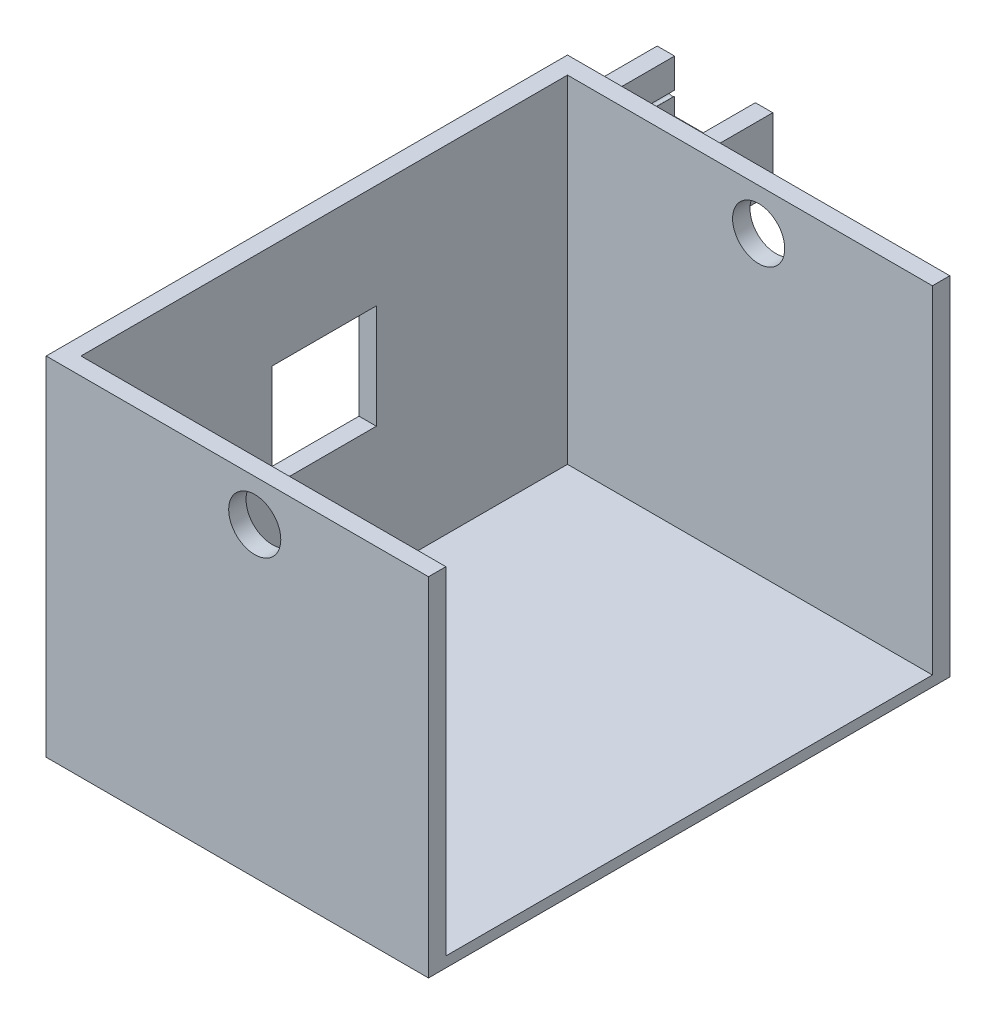
ISO-10303-21;
HEADER;
FILE_DESCRIPTION(('STEP AP214'),'2;1');
FILE_NAME('part.step','',(''),(''),'','','');
FILE_SCHEMA(('AUTOMOTIVE_DESIGN { 1 0 10303 214 1 1 1 1 }'));
ENDSEC;
DATA;
#1=APPLICATION_CONTEXT('core data for automotive mechanical design processes');
#2=APPLICATION_PROTOCOL_DEFINITION('international standard','automotive_design',2000,#1);
#3=PRODUCT_CONTEXT('',#1,'mechanical');
#4=PRODUCT('Part','Part','',(#3));
#5=PRODUCT_RELATED_PRODUCT_CATEGORY('part','',(#4));
#6=PRODUCT_DEFINITION_FORMATION('','',#4);
#7=PRODUCT_DEFINITION_CONTEXT('part definition',#1,'design');
#8=PRODUCT_DEFINITION('design','',#6,#7);
#9=PRODUCT_DEFINITION_SHAPE('','',#8);
#10=(LENGTH_UNIT() NAMED_UNIT(*) SI_UNIT(.MILLI.,.METRE.));
#11=(NAMED_UNIT(*) PLANE_ANGLE_UNIT() SI_UNIT($,.RADIAN.));
#12=(NAMED_UNIT(*) SI_UNIT($,.STERADIAN.) SOLID_ANGLE_UNIT());
#13=UNCERTAINTY_MEASURE_WITH_UNIT(LENGTH_MEASURE(1.E-05),#10,'distance_accuracy_value','');
#14=(GEOMETRIC_REPRESENTATION_CONTEXT(3) GLOBAL_UNCERTAINTY_ASSIGNED_CONTEXT((#13)) GLOBAL_UNIT_ASSIGNED_CONTEXT((#10,
#11,#12)) REPRESENTATION_CONTEXT('',''));
#15=CARTESIAN_POINT('',(0.,0.,0.));
#16=DIRECTION('',(0.,0.,1.));
#17=DIRECTION('',(1.,0.,0.));
#18=AXIS2_PLACEMENT_3D('',#15,#16,#17);
#19=CARTESIAN_POINT('',(45.6699478574615,81.8999999999859,-88.8582089552239));
#20=DIRECTION('',(-1.,0.,0.));
#21=DIRECTION('',(0.,-1.,0.));
#22=AXIS2_PLACEMENT_3D('',#19,#20,#21);
#23=PLANE('',#22);
#24=DIRECTION('',(0.,-1.,0.));
#25=VECTOR('',#24,1.);
#26=CARTESIAN_POINT('',(45.6699478574615,81.8999999999859,-70.6082089552239));
#27=LINE('',#26,#25);
#28=CARTESIAN_POINT('',(45.6699478574615,96.899999999986,-70.6082089552239));
#29=VERTEX_POINT('',#28);
#30=CARTESIAN_POINT('',(45.6699478574615,88.3872440663465,-70.6082089552239));
#31=VERTEX_POINT('',#30);
#32=EDGE_CURVE('E279',#29,#31,#27,.T.);
#33=ORIENTED_EDGE('',*,*,#32,.T.);
#34=DIRECTION('',(0.,0.,-1.));
#35=VECTOR('',#34,1.);
#36=CARTESIAN_POINT('',(45.6699478574615,88.3872440663465,-70.6082089552239));
#37=LINE('',#36,#35);
#38=CARTESIAN_POINT('',(45.6699478574615,88.3872440663465,-88.8582089552239));
#39=VERTEX_POINT('',#38);
#40=EDGE_CURVE('E247',#31,#39,#37,.T.);
#41=ORIENTED_EDGE('',*,*,#40,.T.);
#42=DIRECTION('',(0.,-1.,0.));
#43=VECTOR('',#42,1.);
#44=CARTESIAN_POINT('',(45.6699478574615,81.8999999999859,-88.8582089552239));
#45=LINE('',#44,#43);
#46=CARTESIAN_POINT('',(45.6699478574615,96.899999999986,-88.8582089552239));
#47=VERTEX_POINT('',#46);
#48=EDGE_CURVE('E252',#47,#39,#45,.T.);
#49=ORIENTED_EDGE('',*,*,#48,.F.);
#50=DIRECTION('',(0.,0.,1.));
#51=VECTOR('',#50,1.);
#52=CARTESIAN_POINT('',(45.6699478574615,96.899999999986,-88.8582089552239));
#53=LINE('',#52,#51);
#54=EDGE_CURVE('E278',#47,#29,#53,.T.);
#55=ORIENTED_EDGE('',*,*,#54,.T.);
#56=EDGE_LOOP('',(#33,#41,#49,#55));
#57=FACE_BOUND('',#56,.T.);
#58=ADVANCED_FACE('F47',(#57),#23,.F.);
#59=CARTESIAN_POINT('',(33.1119402985075,200.,-70.6082089552239));
#60=DIRECTION('',(0.,0.,1.));
#61=DIRECTION('',(1.,0.,0.));
#62=AXIS2_PLACEMENT_3D('',#59,#60,#61);
#63=PLANE('',#62);
#64=DIRECTION('',(0.,-1.,0.));
#65=VECTOR('',#64,1.);
#66=CARTESIAN_POINT('',(33.1119402985075,200.,-70.6082089552239));
#67=LINE('',#66,#65);
#68=CARTESIAN_POINT('',(33.1119402985076,100.,-70.6082089552239));
#69=VERTEX_POINT('',#68);
#70=CARTESIAN_POINT('',(33.1119402985075,0.,-70.6082089552239));
#71=VERTEX_POINT('',#70);
#72=EDGE_CURVE('E419',#69,#71,#67,.T.);
#73=ORIENTED_EDGE('',*,*,#72,.F.);
#74=DIRECTION('',(1.,0.,0.));
#75=VECTOR('',#74,1.);
#76=CARTESIAN_POINT('',(143.111940298508,100.,-70.6082089552239));
#77=LINE('',#76,#75);
#78=CARTESIAN_POINT('',(143.111940298508,100.,-70.6082089552239));
#79=VERTEX_POINT('',#78);
#80=EDGE_CURVE('E388',#69,#79,#77,.T.);
#81=ORIENTED_EDGE('',*,*,#80,.T.);
#82=DIRECTION('',(0.,-1.,0.));
#83=VECTOR('',#82,1.);
#84=CARTESIAN_POINT('',(143.111940298508,200.,-70.6082089552239));
#85=LINE('',#84,#83);
#86=CARTESIAN_POINT('',(143.111940298508,0.,-70.6082089552239));
#87=VERTEX_POINT('',#86);
#88=EDGE_CURVE('E422',#79,#87,#85,.T.);
#89=ORIENTED_EDGE('',*,*,#88,.T.);
#90=DIRECTION('',(-1.,0.,0.));
#91=VECTOR('',#90,1.);
#92=CARTESIAN_POINT('',(33.1119402985075,0.,-70.6082089552239));
#93=LINE('',#92,#91);
#94=EDGE_CURVE('E415',#87,#71,#93,.T.);
#95=ORIENTED_EDGE('',*,*,#94,.T.);
#96=EDGE_LOOP('',(#73,#81,#89,#95));
#97=FACE_BOUND('',#96,.T.);
#98=CARTESIAN_POINT('',(93.1119402985076,88.,-70.6082089552239));
#99=DIRECTION('',(0.,0.,1.));
#100=DIRECTION('',(1.,0.,0.));
#101=AXIS2_PLACEMENT_3D('',#98,#99,#100);
#102=CIRCLE('',#101,7.50000000000003);
#103=CARTESIAN_POINT('',(100.611940298508,88.,-70.6082089552239));
#104=VERTEX_POINT('',#103);
#105=EDGE_CURVE('E342',#104,#104,#102,.T.);
#106=ORIENTED_EDGE('',*,*,#105,.T.);
#107=EDGE_LOOP('',(#106));
#108=FACE_BOUND('',#107,.T.);
#109=CARTESIAN_POINT('',(45.6699478574615,86.9138839047077,-70.6082089552239));
#110=VERTEX_POINT('',#109);
#111=CARTESIAN_POINT('',(45.6699478574615,81.8999999999859,-70.6082089552239));
#112=VERTEX_POINT('',#111);
#113=EDGE_CURVE('E251',#110,#112,#27,.T.);
#114=ORIENTED_EDGE('',*,*,#113,.F.);
#115=CARTESIAN_POINT('',(44.8760213344979,87.6505639855271,-70.6082089552239));
#116=DIRECTION('',(0.,0.,-1.));
#117=DIRECTION('',(-1.,0.,0.));
#118=AXIS2_PLACEMENT_3D('',#115,#116,#117);
#119=CIRCLE('',#118,1.08305903132807);
#120=EDGE_CURVE('E232',#110,#31,#119,.T.);
#121=ORIENTED_EDGE('',*,*,#120,.T.);
#122=ORIENTED_EDGE('',*,*,#32,.F.);
#123=DIRECTION('',(1.,0.,0.));
#124=VECTOR('',#123,1.);
#125=CARTESIAN_POINT('',(45.6699478574615,96.899999999986,-70.6082089552239));
#126=LINE('',#125,#124);
#127=CARTESIAN_POINT('',(40.6699478574615,96.899999999986,-70.6082089552239));
#128=VERTEX_POINT('',#127);
#129=EDGE_CURVE('E307',#128,#29,#126,.T.);
#130=ORIENTED_EDGE('',*,*,#129,.F.);
#131=DIRECTION('',(0.,1.,0.));
#132=VECTOR('',#131,1.);
#133=CARTESIAN_POINT('',(40.6699478574615,76.899999999986,-70.6082089552239));
#134=LINE('',#133,#132);
#135=CARTESIAN_POINT('',(40.6699478574615,76.899999999986,-70.6082089552239));
#136=VERTEX_POINT('',#135);
#137=EDGE_CURVE('E303',#136,#128,#134,.T.);
#138=ORIENTED_EDGE('',*,*,#137,.F.);
#139=DIRECTION('',(-1.,0.,0.));
#140=VECTOR('',#139,1.);
#141=CARTESIAN_POINT('',(73.9199478574615,76.899999999986,-70.6082089552239));
#142=LINE('',#141,#140);
#143=CARTESIAN_POINT('',(73.9199478574615,76.899999999986,-70.6082089552239));
#144=VERTEX_POINT('',#143);
#145=EDGE_CURVE('E299',#144,#136,#142,.T.);
#146=ORIENTED_EDGE('',*,*,#145,.F.);
#147=DIRECTION('',(0.,-1.,0.));
#148=VECTOR('',#147,1.);
#149=CARTESIAN_POINT('',(73.9199478574615,76.899999999986,-70.6082089552239));
#150=LINE('',#149,#148);
#151=CARTESIAN_POINT('',(73.9199478574615,96.899999999986,-70.6082089552239));
#152=VERTEX_POINT('',#151);
#153=EDGE_CURVE('E295',#152,#144,#150,.T.);
#154=ORIENTED_EDGE('',*,*,#153,.F.);
#155=DIRECTION('',(1.,0.,0.));
#156=VECTOR('',#155,1.);
#157=CARTESIAN_POINT('',(68.9199478574616,96.899999999986,-70.6082089552239));
#158=LINE('',#157,#156);
#159=CARTESIAN_POINT('',(68.9199478574616,96.899999999986,-70.6082089552239));
#160=VERTEX_POINT('',#159);
#161=EDGE_CURVE('E291',#160,#152,#158,.T.);
#162=ORIENTED_EDGE('',*,*,#161,.F.);
#163=DIRECTION('',(0.,1.,0.));
#164=VECTOR('',#163,1.);
#165=CARTESIAN_POINT('',(68.9199478574616,96.899999999986,-70.6082089552239));
#166=LINE('',#165,#164);
#167=CARTESIAN_POINT('',(68.9199478574616,81.8999999999859,-70.6082089552239));
#168=VERTEX_POINT('',#167);
#169=EDGE_CURVE('E287',#168,#160,#166,.T.);
#170=ORIENTED_EDGE('',*,*,#169,.F.);
#171=DIRECTION('',(1.,0.,0.));
#172=VECTOR('',#171,1.);
#173=CARTESIAN_POINT('',(45.6699478574615,81.8999999999859,-70.6082089552239));
#174=LINE('',#173,#172);
#175=EDGE_CURVE('E283',#112,#168,#174,.T.);
#176=ORIENTED_EDGE('',*,*,#175,.F.);
#177=EDGE_LOOP('',(#114,#121,#122,#130,#138,#146,#154,#162,#170,#176));
#178=FACE_BOUND('',#177,.T.);
#179=ADVANCED_FACE('F472',(#97,#108,#178),#63,.F.);
#180=CARTESIAN_POINT('',(33.1119402985075,200.,-70.6082089552239));
#181=DIRECTION('',(1.,0.,0.));
#182=DIRECTION('',(0.,0.,-1.));
#183=AXIS2_PLACEMENT_3D('',#180,#181,#182);
#184=PLANE('',#183);
#185=DIRECTION('',(0.,0.,1.));
#186=VECTOR('',#185,1.);
#187=CARTESIAN_POINT('',(33.1119402985075,40.,-10.6082089552239));
#188=LINE('',#187,#186);
#189=CARTESIAN_POINT('',(33.1119402985075,40.,-10.6082089552239));
#190=VERTEX_POINT('',#189);
#191=CARTESIAN_POINT('',(33.1119402985075,40.,19.3917910447761));
#192=VERTEX_POINT('',#191);
#193=EDGE_CURVE('E210',#190,#192,#188,.T.);
#194=ORIENTED_EDGE('',*,*,#193,.F.);
#195=DIRECTION('',(0.,-1.,0.));
#196=VECTOR('',#195,1.);
#197=CARTESIAN_POINT('',(33.1119402985075,70.,-10.6082089552239));
#198=LINE('',#197,#196);
#199=CARTESIAN_POINT('',(33.1119402985075,70.,-10.6082089552239));
#200=VERTEX_POINT('',#199);
#201=EDGE_CURVE('E63',#200,#190,#198,.T.);
#202=ORIENTED_EDGE('',*,*,#201,.F.);
#203=DIRECTION('',(0.,0.,-1.));
#204=VECTOR('',#203,1.);
#205=CARTESIAN_POINT('',(33.1119402985075,70.,-10.6082089552239));
#206=LINE('',#205,#204);
#207=CARTESIAN_POINT('',(33.1119402985075,70.,19.3917910447761));
#208=VERTEX_POINT('',#207);
#209=EDGE_CURVE('E217',#208,#200,#206,.T.);
#210=ORIENTED_EDGE('',*,*,#209,.F.);
#211=DIRECTION('',(0.,1.,0.));
#212=VECTOR('',#211,1.);
#213=CARTESIAN_POINT('',(33.1119402985075,70.,19.3917910447761));
#214=LINE('',#213,#212);
#215=EDGE_CURVE('E200',#192,#208,#214,.T.);
#216=ORIENTED_EDGE('',*,*,#215,.F.);
#217=EDGE_LOOP('',(#194,#202,#210,#216));
#218=FACE_BOUND('',#217,.T.);
#219=DIRECTION('',(0.,-1.,0.));
#220=VECTOR('',#219,1.);
#221=CARTESIAN_POINT('',(33.1119402985076,200.,79.3917910447761));
#222=LINE('',#221,#220);
#223=CARTESIAN_POINT('',(33.1119402985076,100.,79.3917910447761));
#224=VERTEX_POINT('',#223);
#225=CARTESIAN_POINT('',(33.1119402985076,0.,79.3917910447761));
#226=VERTEX_POINT('',#225);
#227=EDGE_CURVE('E428',#224,#226,#222,.T.);
#228=ORIENTED_EDGE('',*,*,#227,.F.);
#229=DIRECTION('',(0.,0.,1.));
#230=VECTOR('',#229,1.);
#231=CARTESIAN_POINT('',(33.1119402985076,100.,-70.6082089552239));
#232=LINE('',#231,#230);
#233=EDGE_CURVE('E392',#69,#224,#232,.T.);
#234=ORIENTED_EDGE('',*,*,#233,.F.);
#235=ORIENTED_EDGE('',*,*,#72,.T.);
#236=DIRECTION('',(0.,0.,1.));
#237=VECTOR('',#236,1.);
#238=CARTESIAN_POINT('',(33.1119402985075,0.,-70.6082089552239));
#239=LINE('',#238,#237);
#240=EDGE_CURVE('E400',#71,#226,#239,.T.);
#241=ORIENTED_EDGE('',*,*,#240,.T.);
#242=EDGE_LOOP('',(#228,#234,#235,#241));
#243=FACE_BOUND('',#242,.T.);
#244=ADVANCED_FACE('F49',(#218,#243),#184,.F.);
#245=CARTESIAN_POINT('',(33.1119402985076,200.,79.3917910447761));
#246=DIRECTION('',(0.,0.,-1.));
#247=DIRECTION('',(-1.,0.,0.));
#248=AXIS2_PLACEMENT_3D('',#245,#246,#247);
#249=PLANE('',#248);
#250=CARTESIAN_POINT('',(93.1119402985076,88.,79.3917910447761));
#251=DIRECTION('',(0.,0.,-1.));
#252=DIRECTION('',(-1.,0.,0.));
#253=AXIS2_PLACEMENT_3D('',#250,#251,#252);
#254=CIRCLE('',#253,7.50000000000003);
#255=CARTESIAN_POINT('',(85.6119402985075,88.,79.3917910447761));
#256=VERTEX_POINT('',#255);
#257=EDGE_CURVE('E351',#256,#256,#254,.T.);
#258=ORIENTED_EDGE('',*,*,#257,.T.);
#259=EDGE_LOOP('',(#258));
#260=FACE_BOUND('',#259,.T.);
#261=DIRECTION('',(0.,-1.,0.));
#262=VECTOR('',#261,1.);
#263=CARTESIAN_POINT('',(143.111940298508,200.,79.3917910447761));
#264=LINE('',#263,#262);
#265=CARTESIAN_POINT('',(143.111940298508,100.,79.3917910447761));
#266=VERTEX_POINT('',#265);
#267=CARTESIAN_POINT('',(143.111940298508,0.,79.3917910447761));
#268=VERTEX_POINT('',#267);
#269=EDGE_CURVE('E425',#266,#268,#264,.T.);
#270=ORIENTED_EDGE('',*,*,#269,.F.);
#271=DIRECTION('',(1.,0.,0.));
#272=VECTOR('',#271,1.);
#273=CARTESIAN_POINT('',(143.111940298508,100.,79.3917910447761));
#274=LINE('',#273,#272);
#275=EDGE_CURVE('E387',#224,#266,#274,.T.);
#276=ORIENTED_EDGE('',*,*,#275,.F.);
#277=ORIENTED_EDGE('',*,*,#227,.T.);
#278=DIRECTION('',(1.,0.,0.));
#279=VECTOR('',#278,1.);
#280=CARTESIAN_POINT('',(33.1119402985076,0.,79.3917910447761));
#281=LINE('',#280,#279);
#282=EDGE_CURVE('E407',#226,#268,#281,.T.);
#283=ORIENTED_EDGE('',*,*,#282,.T.);
#284=EDGE_LOOP('',(#270,#276,#277,#283));
#285=FACE_BOUND('',#284,.T.);
#286=ADVANCED_FACE('F651',(#260,#285),#249,.F.);
#287=CARTESIAN_POINT('',(143.111940298508,200.,-70.6082089552239));
#288=DIRECTION('',(-1.,0.,0.));
#289=DIRECTION('',(0.,0.,1.));
#290=AXIS2_PLACEMENT_3D('',#287,#288,#289);
#291=PLANE('',#290);
#292=DIRECTION('',(0.,0.,1.));
#293=VECTOR('',#292,1.);
#294=CARTESIAN_POINT('',(143.111940298508,100.,-70.6082089552239));
#295=LINE('',#294,#293);
#296=CARTESIAN_POINT('',(143.111940298508,100.,-65.6082089552239));
#297=VERTEX_POINT('',#296);
#298=EDGE_CURVE('E396',#79,#297,#295,.T.);
#299=ORIENTED_EDGE('',*,*,#298,.T.);
#300=DIRECTION('',(0.,-1.,0.));
#301=VECTOR('',#300,1.);
#302=CARTESIAN_POINT('',(143.111940298508,200.,-65.6082089552239));
#303=LINE('',#302,#301);
#304=CARTESIAN_POINT('',(143.111940298508,3.,-65.6082089552239));
#305=VERTEX_POINT('',#304);
#306=EDGE_CURVE('E383',#297,#305,#303,.T.);
#307=ORIENTED_EDGE('',*,*,#306,.T.);
#308=DIRECTION('',(0.,0.,-1.));
#309=VECTOR('',#308,1.);
#310=CARTESIAN_POINT('',(143.111940298508,3.,-70.6082089552239));
#311=LINE('',#310,#309);
#312=CARTESIAN_POINT('',(143.111940298508,3.,74.3917910447761));
#313=VERTEX_POINT('',#312);
#314=EDGE_CURVE('E435',#313,#305,#311,.T.);
#315=ORIENTED_EDGE('',*,*,#314,.F.);
#316=DIRECTION('',(0.,1.,0.));
#317=VECTOR('',#316,1.);
#318=CARTESIAN_POINT('',(143.111940298508,200.,74.3917910447761));
#319=LINE('',#318,#317);
#320=CARTESIAN_POINT('',(143.111940298508,100.,74.3917910447761));
#321=VERTEX_POINT('',#320);
#322=EDGE_CURVE('E379',#313,#321,#319,.T.);
#323=ORIENTED_EDGE('',*,*,#322,.T.);
#324=EDGE_CURVE('E401',#321,#266,#295,.T.);
#325=ORIENTED_EDGE('',*,*,#324,.T.);
#326=ORIENTED_EDGE('',*,*,#269,.T.);
#327=DIRECTION('',(0.,0.,-1.));
#328=VECTOR('',#327,1.);
#329=CARTESIAN_POINT('',(143.111940298508,0.,-70.6082089552239));
#330=LINE('',#329,#328);
#331=EDGE_CURVE('E411',#268,#87,#330,.T.);
#332=ORIENTED_EDGE('',*,*,#331,.T.);
#333=ORIENTED_EDGE('',*,*,#88,.F.);
#334=EDGE_LOOP('',(#299,#307,#315,#323,#325,#326,#332,#333));
#335=FACE_BOUND('',#334,.T.);
#336=ADVANCED_FACE('F712',(#335),#291,.F.);
#337=CARTESIAN_POINT('',(0.,0.,0.));
#338=DIRECTION('',(0.,1.,0.));
#339=DIRECTION('',(0.,0.,1.));
#340=AXIS2_PLACEMENT_3D('',#337,#338,#339);
#341=PLANE('',#340);
#342=ORIENTED_EDGE('',*,*,#240,.F.);
#343=ORIENTED_EDGE('',*,*,#94,.F.);
#344=ORIENTED_EDGE('',*,*,#331,.F.);
#345=ORIENTED_EDGE('',*,*,#282,.F.);
#346=EDGE_LOOP('',(#342,#343,#344,#345));
#347=FACE_BOUND('',#346,.T.);
#348=ADVANCED_FACE('F729',(#347),#341,.F.);
#349=CARTESIAN_POINT('',(143.111940298508,100.,-70.6082089552239));
#350=DIRECTION('',(0.,-1.,0.));
#351=DIRECTION('',(0.,0.,-1.));
#352=AXIS2_PLACEMENT_3D('',#349,#350,#351);
#353=PLANE('',#352);
#354=DIRECTION('',(0.,0.,1.));
#355=VECTOR('',#354,1.);
#356=CARTESIAN_POINT('',(38.1119402985076,100.,-65.6082089552239));
#357=LINE('',#356,#355);
#358=CARTESIAN_POINT('',(38.1119402985076,100.,-65.6082089552239));
#359=VERTEX_POINT('',#358);
#360=CARTESIAN_POINT('',(38.1119402985076,100.,74.3917910447761));
#361=VERTEX_POINT('',#360);
#362=EDGE_CURVE('E355',#359,#361,#357,.T.);
#363=ORIENTED_EDGE('',*,*,#362,.F.);
#364=DIRECTION('',(1.,0.,0.));
#365=VECTOR('',#364,1.);
#366=CARTESIAN_POINT('',(143.111940298508,100.,-65.6082089552239));
#367=LINE('',#366,#365);
#368=EDGE_CURVE('E431',#359,#297,#367,.T.);
#369=ORIENTED_EDGE('',*,*,#368,.T.);
#370=ORIENTED_EDGE('',*,*,#298,.F.);
#371=ORIENTED_EDGE('',*,*,#80,.F.);
#372=ORIENTED_EDGE('',*,*,#233,.T.);
#373=ORIENTED_EDGE('',*,*,#275,.T.);
#374=ORIENTED_EDGE('',*,*,#324,.F.);
#375=DIRECTION('',(1.,0.,0.));
#376=VECTOR('',#375,1.);
#377=CARTESIAN_POINT('',(38.1119402985076,100.,74.3917910447761));
#378=LINE('',#377,#376);
#379=EDGE_CURVE('E367',#361,#321,#378,.T.);
#380=ORIENTED_EDGE('',*,*,#379,.F.);
#381=EDGE_LOOP('',(#363,#369,#370,#371,#372,#373,#374,#380));
#382=FACE_BOUND('',#381,.T.);
#383=ADVANCED_FACE('F720',(#382),#353,.F.);
#384=CARTESIAN_POINT('',(0.,3.,0.));
#385=DIRECTION('',(0.,1.,0.));
#386=DIRECTION('',(0.,0.,1.));
#387=AXIS2_PLACEMENT_3D('',#384,#385,#386);
#388=PLANE('',#387);
#389=ORIENTED_EDGE('',*,*,#314,.T.);
#390=DIRECTION('',(1.,0.,0.));
#391=VECTOR('',#390,1.);
#392=CARTESIAN_POINT('',(38.1119402985076,3.,-65.6082089552239));
#393=LINE('',#392,#391);
#394=CARTESIAN_POINT('',(38.1119402985076,3.,-65.6082089552239));
#395=VERTEX_POINT('',#394);
#396=EDGE_CURVE('E356',#395,#305,#393,.T.);
#397=ORIENTED_EDGE('',*,*,#396,.F.);
#398=DIRECTION('',(0.,0.,-1.));
#399=VECTOR('',#398,1.);
#400=CARTESIAN_POINT('',(38.1119402985076,3.,-65.6082089552239));
#401=LINE('',#400,#399);
#402=CARTESIAN_POINT('',(38.1119402985076,3.,74.3917910447761));
#403=VERTEX_POINT('',#402);
#404=EDGE_CURVE('E360',#403,#395,#401,.T.);
#405=ORIENTED_EDGE('',*,*,#404,.F.);
#406=DIRECTION('',(-1.,0.,0.));
#407=VECTOR('',#406,1.);
#408=CARTESIAN_POINT('',(38.1119402985076,3.,74.3917910447761));
#409=LINE('',#408,#407);
#410=EDGE_CURVE('E364',#313,#403,#409,.T.);
#411=ORIENTED_EDGE('',*,*,#410,.F.);
#412=EDGE_LOOP('',(#389,#397,#405,#411));
#413=FACE_BOUND('',#412,.T.);
#414=ADVANCED_FACE('F703',(#413),#388,.T.);
#415=CARTESIAN_POINT('',(38.1119402985076,-190.808405719138,-65.6082089552239));
#416=DIRECTION('',(0.,0.,-1.));
#417=DIRECTION('',(-1.,0.,0.));
#418=AXIS2_PLACEMENT_3D('',#415,#416,#417);
#419=PLANE('',#418);
#420=CARTESIAN_POINT('',(93.1119402985076,88.,-65.6082089552239));
#421=DIRECTION('',(0.,0.,-1.));
#422=DIRECTION('',(-1.,0.,0.));
#423=AXIS2_PLACEMENT_3D('',#420,#421,#422);
#424=CIRCLE('',#423,7.50000000000003);
#425=CARTESIAN_POINT('',(85.6119402985075,88.,-65.6082089552239));
#426=VERTEX_POINT('',#425);
#427=EDGE_CURVE('E347',#426,#426,#424,.T.);
#428=ORIENTED_EDGE('',*,*,#427,.T.);
#429=EDGE_LOOP('',(#428));
#430=FACE_BOUND('',#429,.T.);
#431=ORIENTED_EDGE('',*,*,#368,.F.);
#432=DIRECTION('',(0.,1.,0.));
#433=VECTOR('',#432,1.);
#434=CARTESIAN_POINT('',(38.1119402985076,-190.808405719138,-65.6082089552239));
#435=LINE('',#434,#433);
#436=EDGE_CURVE('E361',#395,#359,#435,.T.);
#437=ORIENTED_EDGE('',*,*,#436,.F.);
#438=ORIENTED_EDGE('',*,*,#396,.T.);
#439=ORIENTED_EDGE('',*,*,#306,.F.);
#440=EDGE_LOOP('',(#431,#437,#438,#439));
#441=FACE_BOUND('',#440,.T.);
#442=ADVANCED_FACE('F698',(#430,#441),#419,.F.);
#443=CARTESIAN_POINT('',(38.1119402985076,-190.808405719138,74.3917910447761));
#444=DIRECTION('',(0.,0.,1.));
#445=DIRECTION('',(1.,0.,0.));
#446=AXIS2_PLACEMENT_3D('',#443,#444,#445);
#447=PLANE('',#446);
#448=CARTESIAN_POINT('',(93.1119402985076,88.,74.3917910447761));
#449=DIRECTION('',(0.,0.,1.));
#450=DIRECTION('',(1.,0.,0.));
#451=AXIS2_PLACEMENT_3D('',#448,#449,#450);
#452=CIRCLE('',#451,7.50000000000003);
#453=CARTESIAN_POINT('',(100.611940298508,88.,74.3917910447761));
#454=VERTEX_POINT('',#453);
#455=EDGE_CURVE('E346',#454,#454,#452,.T.);
#456=ORIENTED_EDGE('',*,*,#455,.T.);
#457=EDGE_LOOP('',(#456));
#458=FACE_BOUND('',#457,.T.);
#459=ORIENTED_EDGE('',*,*,#410,.T.);
#460=DIRECTION('',(0.,1.,0.));
#461=VECTOR('',#460,1.);
#462=CARTESIAN_POINT('',(38.1119402985076,-190.808405719138,74.3917910447761));
#463=LINE('',#462,#461);
#464=EDGE_CURVE('E370',#403,#361,#463,.T.);
#465=ORIENTED_EDGE('',*,*,#464,.T.);
#466=ORIENTED_EDGE('',*,*,#379,.T.);
#467=ORIENTED_EDGE('',*,*,#322,.F.);
#468=EDGE_LOOP('',(#459,#465,#466,#467));
#469=FACE_BOUND('',#468,.T.);
#470=ADVANCED_FACE('F658',(#458,#469),#447,.F.);
#471=CARTESIAN_POINT('',(38.1119402985076,-190.808405719138,-65.6082089552239));
#472=DIRECTION('',(-1.,0.,0.));
#473=DIRECTION('',(0.,0.,1.));
#474=AXIS2_PLACEMENT_3D('',#471,#472,#473);
#475=PLANE('',#474);
#476=DIRECTION('',(0.,0.,-1.));
#477=VECTOR('',#476,1.);
#478=CARTESIAN_POINT('',(38.1119402985076,70.,-65.6082089552239));
#479=LINE('',#478,#477);
#480=CARTESIAN_POINT('',(38.1119402985076,70.,19.3917910447761));
#481=VERTEX_POINT('',#480);
#482=CARTESIAN_POINT('',(38.1119402985076,70.,-10.6082089552239));
#483=VERTEX_POINT('',#482);
#484=EDGE_CURVE('E56',#481,#483,#479,.T.);
#485=ORIENTED_EDGE('',*,*,#484,.T.);
#486=DIRECTION('',(0.,-1.,0.));
#487=VECTOR('',#486,1.);
#488=CARTESIAN_POINT('',(38.1119402985076,-190.808405719138,-10.6082089552239));
#489=LINE('',#488,#487);
#490=CARTESIAN_POINT('',(38.1119402985076,40.,-10.6082089552239));
#491=VERTEX_POINT('',#490);
#492=EDGE_CURVE('E12',#483,#491,#489,.T.);
#493=ORIENTED_EDGE('',*,*,#492,.T.);
#494=DIRECTION('',(0.,0.,1.));
#495=VECTOR('',#494,1.);
#496=CARTESIAN_POINT('',(38.1119402985076,40.,-65.6082089552239));
#497=LINE('',#496,#495);
#498=CARTESIAN_POINT('',(38.1119402985076,40.,19.3917910447761));
#499=VERTEX_POINT('',#498);
#500=EDGE_CURVE('E445',#491,#499,#497,.T.);
#501=ORIENTED_EDGE('',*,*,#500,.T.);
#502=DIRECTION('',(0.,1.,0.));
#503=VECTOR('',#502,1.);
#504=CARTESIAN_POINT('',(38.1119402985076,-190.808405719138,19.3917910447762));
#505=LINE('',#504,#503);
#506=EDGE_CURVE('E203',#499,#481,#505,.T.);
#507=ORIENTED_EDGE('',*,*,#506,.T.);
#508=EDGE_LOOP('',(#485,#493,#501,#507));
#509=FACE_BOUND('',#508,.T.);
#510=ORIENTED_EDGE('',*,*,#404,.T.);
#511=ORIENTED_EDGE('',*,*,#436,.T.);
#512=ORIENTED_EDGE('',*,*,#362,.T.);
#513=ORIENTED_EDGE('',*,*,#464,.F.);
#514=EDGE_LOOP('',(#510,#511,#512,#513));
#515=FACE_BOUND('',#514,.T.);
#516=ADVANCED_FACE('F452',(#509,#515),#475,.F.);
#517=CARTESIAN_POINT('',(93.1119402985076,88.,-70.6082089552239));
#518=DIRECTION('',(0.,0.,1.));
#519=DIRECTION('',(1.,0.,0.));
#520=AXIS2_PLACEMENT_3D('',#517,#518,#519);
#521=CYLINDRICAL_SURFACE('',#520,7.50000000000003);
#522=ORIENTED_EDGE('',*,*,#455,.F.);
#523=EDGE_LOOP('',(#522));
#524=FACE_BOUND('',#523,.T.);
#525=ORIENTED_EDGE('',*,*,#257,.F.);
#526=EDGE_LOOP('',(#525));
#527=FACE_BOUND('',#526,.T.);
#528=ADVANCED_FACE('F495',(#524,#527),#521,.F.);
#529=ORIENTED_EDGE('',*,*,#105,.F.);
#530=EDGE_LOOP('',(#529));
#531=FACE_BOUND('',#530,.T.);
#532=ORIENTED_EDGE('',*,*,#427,.F.);
#533=EDGE_LOOP('',(#532));
#534=FACE_BOUND('',#533,.T.);
#535=ADVANCED_FACE('F486',(#531,#534),#521,.F.);
#536=CARTESIAN_POINT('',(45.6699478574615,86.9138839047077,-88.8582089552239));
#537=VERTEX_POINT('',#536);
#538=CARTESIAN_POINT('',(45.6699478574615,81.8999999999859,-88.8582089552239));
#539=VERTEX_POINT('',#538);
#540=EDGE_CURVE('E257',#537,#539,#45,.T.);
#541=ORIENTED_EDGE('',*,*,#540,.F.);
#542=DIRECTION('',(0.,0.,-1.));
#543=VECTOR('',#542,1.);
#544=CARTESIAN_POINT('',(45.6699478574615,86.9138839047077,-70.6082089552239));
#545=LINE('',#544,#543);
#546=EDGE_CURVE('E236',#537,#110,#545,.F.);
#547=ORIENTED_EDGE('',*,*,#546,.T.);
#548=ORIENTED_EDGE('',*,*,#113,.T.);
#549=DIRECTION('',(0.,0.,1.));
#550=VECTOR('',#549,1.);
#551=CARTESIAN_POINT('',(45.6699478574615,81.8999999999859,-88.8582089552239));
#552=LINE('',#551,#550);
#553=EDGE_CURVE('E338',#539,#112,#552,.T.);
#554=ORIENTED_EDGE('',*,*,#553,.F.);
#555=EDGE_LOOP('',(#541,#547,#548,#554));
#556=FACE_BOUND('',#555,.T.);
#557=ADVANCED_FACE('F475',(#556),#23,.F.);
#558=CARTESIAN_POINT('',(45.6699478574615,81.8999999999859,-88.8582089552239));
#559=DIRECTION('',(0.,-1.,0.));
#560=DIRECTION('',(0.,0.,-1.));
#561=AXIS2_PLACEMENT_3D('',#558,#559,#560);
#562=PLANE('',#561);
#563=ORIENTED_EDGE('',*,*,#175,.T.);
#564=DIRECTION('',(0.,0.,1.));
#565=VECTOR('',#564,1.);
#566=CARTESIAN_POINT('',(68.9199478574616,81.8999999999859,-88.8582089552239));
#567=LINE('',#566,#565);
#568=CARTESIAN_POINT('',(68.9199478574616,81.8999999999859,-88.8582089552239));
#569=VERTEX_POINT('',#568);
#570=EDGE_CURVE('E334',#569,#168,#567,.T.);
#571=ORIENTED_EDGE('',*,*,#570,.F.);
#572=DIRECTION('',(1.,0.,0.));
#573=VECTOR('',#572,1.);
#574=CARTESIAN_POINT('',(45.6699478574615,81.8999999999859,-88.8582089552239));
#575=LINE('',#574,#573);
#576=EDGE_CURVE('E256',#539,#569,#575,.T.);
#577=ORIENTED_EDGE('',*,*,#576,.F.);
#578=ORIENTED_EDGE('',*,*,#553,.T.);
#579=EDGE_LOOP('',(#563,#571,#577,#578));
#580=FACE_BOUND('',#579,.T.);
#581=ADVANCED_FACE('F485',(#580),#562,.F.);
#582=CARTESIAN_POINT('',(68.9199478574616,96.899999999986,-88.8582089552239));
#583=DIRECTION('',(1.,0.,0.));
#584=DIRECTION('',(0.,0.,-1.));
#585=AXIS2_PLACEMENT_3D('',#582,#583,#584);
#586=PLANE('',#585);
#587=ORIENTED_EDGE('',*,*,#169,.T.);
#588=DIRECTION('',(0.,0.,1.));
#589=VECTOR('',#588,1.);
#590=CARTESIAN_POINT('',(68.9199478574616,96.899999999986,-88.8582089552239));
#591=LINE('',#590,#589);
#592=CARTESIAN_POINT('',(68.9199478574616,96.899999999986,-88.8582089552239));
#593=VERTEX_POINT('',#592);
#594=EDGE_CURVE('E330',#593,#160,#591,.T.);
#595=ORIENTED_EDGE('',*,*,#594,.F.);
#596=DIRECTION('',(0.,1.,0.));
#597=VECTOR('',#596,1.);
#598=CARTESIAN_POINT('',(68.9199478574616,96.899999999986,-88.8582089552239));
#599=LINE('',#598,#597);
#600=EDGE_CURVE('E260',#569,#593,#599,.T.);
#601=ORIENTED_EDGE('',*,*,#600,.F.);
#602=ORIENTED_EDGE('',*,*,#570,.T.);
#603=EDGE_LOOP('',(#587,#595,#601,#602));
#604=FACE_BOUND('',#603,.T.);
#605=ADVANCED_FACE('F492',(#604),#586,.F.);
#606=CARTESIAN_POINT('',(68.9199478574616,96.899999999986,-88.8582089552239));
#607=DIRECTION('',(0.,-1.,0.));
#608=DIRECTION('',(0.,0.,-1.));
#609=AXIS2_PLACEMENT_3D('',#606,#607,#608);
#610=PLANE('',#609);
#611=ORIENTED_EDGE('',*,*,#161,.T.);
#612=DIRECTION('',(0.,0.,1.));
#613=VECTOR('',#612,1.);
#614=CARTESIAN_POINT('',(73.9199478574615,96.899999999986,-88.8582089552239));
#615=LINE('',#614,#613);
#616=CARTESIAN_POINT('',(73.9199478574615,96.899999999986,-88.8582089552239));
#617=VERTEX_POINT('',#616);
#618=EDGE_CURVE('E326',#617,#152,#615,.T.);
#619=ORIENTED_EDGE('',*,*,#618,.F.);
#620=DIRECTION('',(1.,0.,0.));
#621=VECTOR('',#620,1.);
#622=CARTESIAN_POINT('',(68.9199478574616,96.899999999986,-88.8582089552239));
#623=LINE('',#622,#621);
#624=EDGE_CURVE('E263',#593,#617,#623,.T.);
#625=ORIENTED_EDGE('',*,*,#624,.F.);
#626=ORIENTED_EDGE('',*,*,#594,.T.);
#627=EDGE_LOOP('',(#611,#619,#625,#626));
#628=FACE_BOUND('',#627,.T.);
#629=ADVANCED_FACE('F514',(#628),#610,.F.);
#630=CARTESIAN_POINT('',(73.9199478574615,76.899999999986,-88.8582089552239));
#631=DIRECTION('',(-1.,0.,0.));
#632=DIRECTION('',(0.,0.,1.));
#633=AXIS2_PLACEMENT_3D('',#630,#631,#632);
#634=PLANE('',#633);
#635=ORIENTED_EDGE('',*,*,#153,.T.);
#636=DIRECTION('',(0.,0.,1.));
#637=VECTOR('',#636,1.);
#638=CARTESIAN_POINT('',(73.9199478574615,76.899999999986,-88.8582089552239));
#639=LINE('',#638,#637);
#640=CARTESIAN_POINT('',(73.9199478574615,76.899999999986,-88.8582089552239));
#641=VERTEX_POINT('',#640);
#642=EDGE_CURVE('E322',#641,#144,#639,.T.);
#643=ORIENTED_EDGE('',*,*,#642,.F.);
#644=DIRECTION('',(0.,-1.,0.));
#645=VECTOR('',#644,1.);
#646=CARTESIAN_POINT('',(73.9199478574615,76.899999999986,-88.8582089552239));
#647=LINE('',#646,#645);
#648=EDGE_CURVE('E266',#617,#641,#647,.T.);
#649=ORIENTED_EDGE('',*,*,#648,.F.);
#650=ORIENTED_EDGE('',*,*,#618,.T.);
#651=EDGE_LOOP('',(#635,#643,#649,#650));
#652=FACE_BOUND('',#651,.T.);
#653=ADVANCED_FACE('F518',(#652),#634,.F.);
#654=CARTESIAN_POINT('',(73.9199478574615,76.899999999986,-88.8582089552239));
#655=DIRECTION('',(0.,1.,0.));
#656=DIRECTION('',(-1.,0.,0.));
#657=AXIS2_PLACEMENT_3D('',#654,#655,#656);
#658=PLANE('',#657);
#659=ORIENTED_EDGE('',*,*,#145,.T.);
#660=DIRECTION('',(0.,0.,1.));
#661=VECTOR('',#660,1.);
#662=CARTESIAN_POINT('',(40.6699478574615,76.899999999986,-88.8582089552239));
#663=LINE('',#662,#661);
#664=CARTESIAN_POINT('',(40.6699478574615,76.899999999986,-88.8582089552239));
#665=VERTEX_POINT('',#664);
#666=EDGE_CURVE('E318',#665,#136,#663,.T.);
#667=ORIENTED_EDGE('',*,*,#666,.F.);
#668=DIRECTION('',(-1.,0.,0.));
#669=VECTOR('',#668,1.);
#670=CARTESIAN_POINT('',(73.9199478574615,76.899999999986,-88.8582089552239));
#671=LINE('',#670,#669);
#672=EDGE_CURVE('E269',#641,#665,#671,.T.);
#673=ORIENTED_EDGE('',*,*,#672,.F.);
#674=ORIENTED_EDGE('',*,*,#642,.T.);
#675=EDGE_LOOP('',(#659,#667,#673,#674));
#676=FACE_BOUND('',#675,.T.);
#677=ADVANCED_FACE('F524',(#676),#658,.F.);
#678=CARTESIAN_POINT('',(40.6699478574615,76.899999999986,-88.8582089552239));
#679=DIRECTION('',(1.,0.,0.));
#680=DIRECTION('',(0.,1.,0.));
#681=AXIS2_PLACEMENT_3D('',#678,#679,#680);
#682=PLANE('',#681);
#683=ORIENTED_EDGE('',*,*,#137,.T.);
#684=DIRECTION('',(0.,0.,1.));
#685=VECTOR('',#684,1.);
#686=CARTESIAN_POINT('',(40.6699478574615,96.899999999986,-88.8582089552239));
#687=LINE('',#686,#685);
#688=CARTESIAN_POINT('',(40.6699478574615,96.899999999986,-88.8582089552239));
#689=VERTEX_POINT('',#688);
#690=EDGE_CURVE('E314',#689,#128,#687,.T.);
#691=ORIENTED_EDGE('',*,*,#690,.F.);
#692=DIRECTION('',(0.,1.,0.));
#693=VECTOR('',#692,1.);
#694=CARTESIAN_POINT('',(40.6699478574615,76.899999999986,-88.8582089552239));
#695=LINE('',#694,#693);
#696=EDGE_CURVE('E272',#665,#689,#695,.T.);
#697=ORIENTED_EDGE('',*,*,#696,.F.);
#698=ORIENTED_EDGE('',*,*,#666,.T.);
#699=EDGE_LOOP('',(#683,#691,#697,#698));
#700=FACE_BOUND('',#699,.T.);
#701=ADVANCED_FACE('F526',(#700),#682,.F.);
#702=CARTESIAN_POINT('',(45.6699478574615,96.899999999986,-88.8582089552239));
#703=DIRECTION('',(0.,-1.,0.));
#704=DIRECTION('',(1.,0.,0.));
#705=AXIS2_PLACEMENT_3D('',#702,#703,#704);
#706=PLANE('',#705);
#707=ORIENTED_EDGE('',*,*,#129,.T.);
#708=ORIENTED_EDGE('',*,*,#54,.F.);
#709=DIRECTION('',(1.,0.,0.));
#710=VECTOR('',#709,1.);
#711=CARTESIAN_POINT('',(45.6699478574615,96.899999999986,-88.8582089552239));
#712=LINE('',#711,#710);
#713=EDGE_CURVE('E275',#689,#47,#712,.T.);
#714=ORIENTED_EDGE('',*,*,#713,.F.);
#715=ORIENTED_EDGE('',*,*,#690,.T.);
#716=EDGE_LOOP('',(#707,#708,#714,#715));
#717=FACE_BOUND('',#716,.T.);
#718=ADVANCED_FACE('F530',(#717),#706,.F.);
#719=CARTESIAN_POINT('',(0.,0.,-88.8582089552239));
#720=DIRECTION('',(0.,0.,1.));
#721=DIRECTION('',(1.,0.,0.));
#722=AXIS2_PLACEMENT_3D('',#719,#720,#721);
#723=PLANE('',#722);
#724=CARTESIAN_POINT('',(70.9949478574615,87.9999999999866,-88.8582089552239));
#725=DIRECTION('',(0.,0.,-1.));
#726=DIRECTION('',(-1.,0.,0.));
#727=AXIS2_PLACEMENT_3D('',#724,#725,#726);
#728=CIRCLE('',#727,0.999999999999998);
#729=CARTESIAN_POINT('',(69.9949478574615,87.9999999999866,-88.8582089552239));
#730=VERTEX_POINT('',#729);
#731=EDGE_CURVE('E237',#730,#730,#728,.T.);
#732=ORIENTED_EDGE('',*,*,#731,.F.);
#733=EDGE_LOOP('',(#732));
#734=FACE_BOUND('',#733,.T.);
#735=ORIENTED_EDGE('',*,*,#48,.T.);
#736=CARTESIAN_POINT('',(44.8760213344979,87.6505639855271,-88.8582089552239));
#737=DIRECTION('',(0.,0.,1.));
#738=DIRECTION('',(1.,0.,0.));
#739=AXIS2_PLACEMENT_3D('',#736,#737,#738);
#740=CIRCLE('',#739,1.08305903132807);
#741=EDGE_CURVE('E438',#39,#537,#740,.T.);
#742=ORIENTED_EDGE('',*,*,#741,.T.);
#743=ORIENTED_EDGE('',*,*,#540,.T.);
#744=ORIENTED_EDGE('',*,*,#576,.T.);
#745=ORIENTED_EDGE('',*,*,#600,.T.);
#746=ORIENTED_EDGE('',*,*,#624,.T.);
#747=ORIENTED_EDGE('',*,*,#648,.T.);
#748=ORIENTED_EDGE('',*,*,#672,.T.);
#749=ORIENTED_EDGE('',*,*,#696,.T.);
#750=ORIENTED_EDGE('',*,*,#713,.T.);
#751=EDGE_LOOP('',(#735,#742,#743,#744,#745,#746,#747,#748,#749,#750));
#752=FACE_BOUND('',#751,.T.);
#753=ADVANCED_FACE('F508',(#734,#752),#723,.F.);
#754=CARTESIAN_POINT('',(70.9949478574615,87.9999999999866,-70.6082089552239));
#755=DIRECTION('',(0.,0.,-1.));
#756=DIRECTION('',(-1.,0.,0.));
#757=AXIS2_PLACEMENT_3D('',#754,#755,#756);
#758=CYLINDRICAL_SURFACE('',#757,0.999999999999998);
#759=CARTESIAN_POINT('',(70.9949478574615,87.9999999999866,-70.6082089552239));
#760=DIRECTION('',(0.,0.,-1.));
#761=DIRECTION('',(-1.,0.,0.));
#762=AXIS2_PLACEMENT_3D('',#759,#760,#761);
#763=CIRCLE('',#762,0.999999999999998);
#764=CARTESIAN_POINT('',(69.9949478574615,87.9999999999866,-70.6082089552239));
#765=VERTEX_POINT('',#764);
#766=EDGE_CURVE('E227',#765,#765,#763,.T.);
#767=ORIENTED_EDGE('',*,*,#766,.F.);
#768=EDGE_LOOP('',(#767));
#769=FACE_BOUND('',#768,.T.);
#770=ORIENTED_EDGE('',*,*,#731,.T.);
#771=EDGE_LOOP('',(#770));
#772=FACE_BOUND('',#771,.T.);
#773=ADVANCED_FACE('F536',(#769,#772),#758,.F.);
#774=CARTESIAN_POINT('',(70.9949478574615,87.9999999999866,-70.6082089552239));
#775=DIRECTION('',(0.,0.,-1.));
#776=DIRECTION('',(-1.,0.,0.));
#777=AXIS2_PLACEMENT_3D('',#774,#775,#776);
#778=PLANE('',#777);
#779=ORIENTED_EDGE('',*,*,#766,.T.);
#780=EDGE_LOOP('',(#779));
#781=FACE_BOUND('',#780,.T.);
#782=ADVANCED_FACE('F467',(#781),#778,.T.);
#783=CARTESIAN_POINT('',(44.8760213344979,87.6505639855271,-70.6082089552239));
#784=DIRECTION('',(0.,0.,-1.));
#785=DIRECTION('',(-1.,0.,0.));
#786=AXIS2_PLACEMENT_3D('',#783,#784,#785);
#787=CYLINDRICAL_SURFACE('',#786,1.08305903132807);
#788=ORIENTED_EDGE('',*,*,#120,.F.);
#789=ORIENTED_EDGE('',*,*,#546,.F.);
#790=ORIENTED_EDGE('',*,*,#741,.F.);
#791=ORIENTED_EDGE('',*,*,#40,.F.);
#792=EDGE_LOOP('',(#788,#789,#790,#791));
#793=FACE_BOUND('',#792,.T.);
#794=ADVANCED_FACE('F459',(#793),#787,.F.);
#795=CARTESIAN_POINT('',(43.1119402985076,70.,-10.6082089552239));
#796=DIRECTION('',(0.,0.,-1.));
#797=DIRECTION('',(-1.,0.,0.));
#798=AXIS2_PLACEMENT_3D('',#795,#796,#797);
#799=PLANE('',#798);
#800=DIRECTION('',(-1.,0.,0.));
#801=VECTOR('',#800,1.);
#802=CARTESIAN_POINT('',(43.1119402985076,70.,-10.6082089552239));
#803=LINE('',#802,#801);
#804=EDGE_CURVE('E224',#483,#200,#803,.T.);
#805=ORIENTED_EDGE('',*,*,#804,.T.);
#806=ORIENTED_EDGE('',*,*,#201,.T.);
#807=DIRECTION('',(-1.,0.,0.));
#808=VECTOR('',#807,1.);
#809=CARTESIAN_POINT('',(43.1119402985076,40.,-10.6082089552239));
#810=LINE('',#809,#808);
#811=EDGE_CURVE('E207',#491,#190,#810,.T.);
#812=ORIENTED_EDGE('',*,*,#811,.F.);
#813=ORIENTED_EDGE('',*,*,#492,.F.);
#814=EDGE_LOOP('',(#805,#806,#812,#813));
#815=FACE_BOUND('',#814,.T.);
#816=ADVANCED_FACE('F457',(#815),#799,.F.);
#817=CARTESIAN_POINT('',(43.1119402985076,70.,-10.6082089552239));
#818=DIRECTION('',(0.,1.,0.));
#819=DIRECTION('',(0.,0.,1.));
#820=AXIS2_PLACEMENT_3D('',#817,#818,#819);
#821=PLANE('',#820);
#822=DIRECTION('',(-1.,0.,0.));
#823=VECTOR('',#822,1.);
#824=CARTESIAN_POINT('',(43.1119402985076,70.,19.3917910447761));
#825=LINE('',#824,#823);
#826=EDGE_CURVE('E206',#481,#208,#825,.T.);
#827=ORIENTED_EDGE('',*,*,#826,.T.);
#828=ORIENTED_EDGE('',*,*,#209,.T.);
#829=ORIENTED_EDGE('',*,*,#804,.F.);
#830=ORIENTED_EDGE('',*,*,#484,.F.);
#831=EDGE_LOOP('',(#827,#828,#829,#830));
#832=FACE_BOUND('',#831,.T.);
#833=ADVANCED_FACE('F456',(#832),#821,.F.);
#834=CARTESIAN_POINT('',(43.1119402985076,70.,19.3917910447761));
#835=DIRECTION('',(0.,0.,1.));
#836=DIRECTION('',(1.,0.,0.));
#837=AXIS2_PLACEMENT_3D('',#834,#835,#836);
#838=PLANE('',#837);
#839=DIRECTION('',(-1.,0.,0.));
#840=VECTOR('',#839,1.);
#841=CARTESIAN_POINT('',(43.1119402985076,40.,19.3917910447761));
#842=LINE('',#841,#840);
#843=EDGE_CURVE('E71',#499,#192,#842,.T.);
#844=ORIENTED_EDGE('',*,*,#843,.T.);
#845=ORIENTED_EDGE('',*,*,#215,.T.);
#846=ORIENTED_EDGE('',*,*,#826,.F.);
#847=ORIENTED_EDGE('',*,*,#506,.F.);
#848=EDGE_LOOP('',(#844,#845,#846,#847));
#849=FACE_BOUND('',#848,.T.);
#850=ADVANCED_FACE('F197',(#849),#838,.F.);
#851=CARTESIAN_POINT('',(43.1119402985076,40.,-10.6082089552239));
#852=DIRECTION('',(0.,-1.,0.));
#853=DIRECTION('',(0.,0.,-1.));
#854=AXIS2_PLACEMENT_3D('',#851,#852,#853);
#855=PLANE('',#854);
#856=ORIENTED_EDGE('',*,*,#811,.T.);
#857=ORIENTED_EDGE('',*,*,#193,.T.);
#858=ORIENTED_EDGE('',*,*,#843,.F.);
#859=ORIENTED_EDGE('',*,*,#500,.F.);
#860=EDGE_LOOP('',(#856,#857,#858,#859));
#861=FACE_BOUND('',#860,.T.);
#862=ADVANCED_FACE('F211',(#861),#855,.F.);
#863=CLOSED_SHELL('',(#58,#179,#244,#286,#336,#348,#383,#414,#442,#470,#516,#528,#535,#557,#581,
#605,#629,#653,#677,#701,#718,#753,#773,#782,#794,#816,#833,#850,#862));
#864=MANIFOLD_SOLID_BREP('B2',#863);
#865=ADVANCED_BREP_SHAPE_REPRESENTATION('',(#18,#864),#14);
#866=SHAPE_DEFINITION_REPRESENTATION(#9,#865);
ENDSEC;
END-ISO-10303-21;
